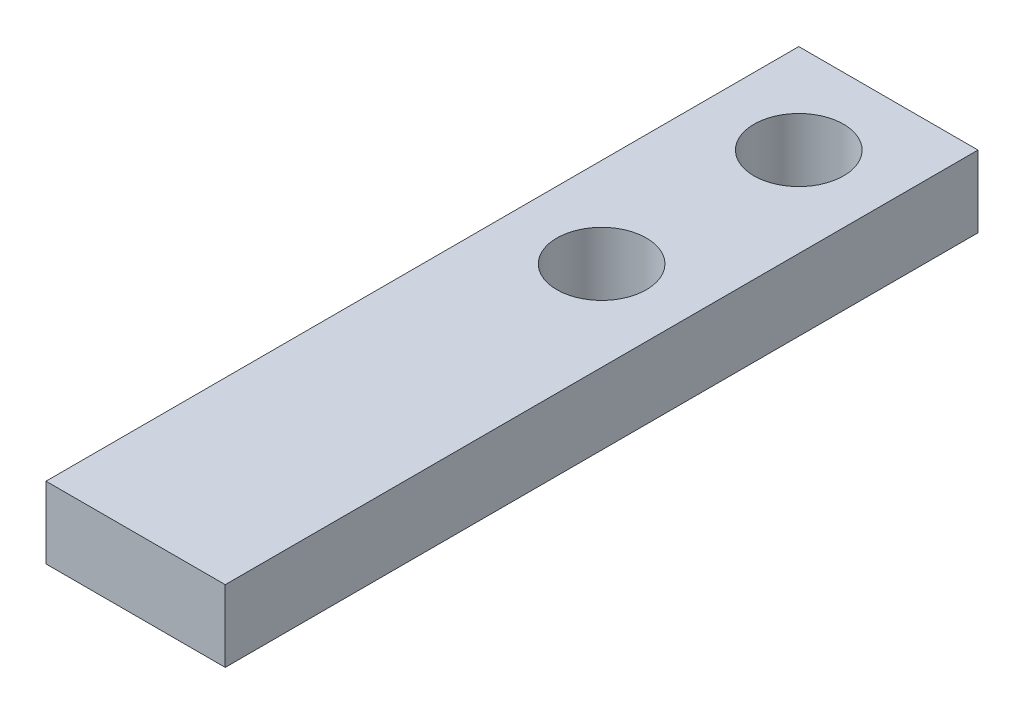
ISO-10303-21;
HEADER;
FILE_DESCRIPTION(('STEP AP214'),'2;1');
FILE_NAME('part.step','',(''),(''),'','','');
FILE_SCHEMA(('AUTOMOTIVE_DESIGN { 1 0 10303 214 1 1 1 1 }'));
ENDSEC;
DATA;
#1=APPLICATION_CONTEXT('core data for automotive mechanical design processes');
#2=APPLICATION_PROTOCOL_DEFINITION('international standard','automotive_design',2000,#1);
#3=PRODUCT_CONTEXT('',#1,'mechanical');
#4=PRODUCT('Part','Part','',(#3));
#5=PRODUCT_RELATED_PRODUCT_CATEGORY('part','',(#4));
#6=PRODUCT_DEFINITION_FORMATION('','',#4);
#7=PRODUCT_DEFINITION_CONTEXT('part definition',#1,'design');
#8=PRODUCT_DEFINITION('design','',#6,#7);
#9=PRODUCT_DEFINITION_SHAPE('','',#8);
#10=(LENGTH_UNIT() NAMED_UNIT(*) SI_UNIT(.MILLI.,.METRE.));
#11=(NAMED_UNIT(*) PLANE_ANGLE_UNIT() SI_UNIT($,.RADIAN.));
#12=(NAMED_UNIT(*) SI_UNIT($,.STERADIAN.) SOLID_ANGLE_UNIT());
#13=UNCERTAINTY_MEASURE_WITH_UNIT(LENGTH_MEASURE(1.E-05),#10,'distance_accuracy_value','');
#14=(GEOMETRIC_REPRESENTATION_CONTEXT(3) GLOBAL_UNCERTAINTY_ASSIGNED_CONTEXT((#13)) GLOBAL_UNIT_ASSIGNED_CONTEXT((#10,
#11,#12)) REPRESENTATION_CONTEXT('',''));
#15=CARTESIAN_POINT('',(0.,0.,0.));
#16=DIRECTION('',(0.,0.,1.));
#17=DIRECTION('',(1.,0.,0.));
#18=AXIS2_PLACEMENT_3D('',#15,#16,#17);
#19=CARTESIAN_POINT('',(0.,4.,0.));
#20=DIRECTION('',(0.,1.,0.));
#21=DIRECTION('',(0.,0.,1.));
#22=AXIS2_PLACEMENT_3D('',#19,#20,#21);
#23=PLANE('',#22);
#24=CARTESIAN_POINT('',(0.,4.,-16.));
#25=DIRECTION('',(0.,1.,0.));
#26=DIRECTION('',(0.,0.,1.));
#27=AXIS2_PLACEMENT_3D('',#24,#25,#26);
#28=CIRCLE('',#27,2.5);
#29=CARTESIAN_POINT('',(0.,4.,-13.5));
#30=VERTEX_POINT('',#29);
#31=EDGE_CURVE('E104',#30,#30,#28,.T.);
#32=ORIENTED_EDGE('',*,*,#31,.F.);
#33=EDGE_LOOP('',(#32));
#34=FACE_BOUND('',#33,.T.);
#35=DIRECTION('',(0.,0.,1.));
#36=VECTOR('',#35,1.);
#37=CARTESIAN_POINT('',(-5.,4.,-21.));
#38=LINE('',#37,#36);
#39=CARTESIAN_POINT('',(-5.,4.,-21.));
#40=VERTEX_POINT('',#39);
#41=CARTESIAN_POINT('',(-5.,4.,21.));
#42=VERTEX_POINT('',#41);
#43=EDGE_CURVE('E89',#40,#42,#38,.T.);
#44=ORIENTED_EDGE('',*,*,#43,.T.);
#45=DIRECTION('',(1.,0.,0.));
#46=VECTOR('',#45,1.);
#47=CARTESIAN_POINT('',(-5.,4.,21.));
#48=LINE('',#47,#46);
#49=CARTESIAN_POINT('',(5.,4.,21.));
#50=VERTEX_POINT('',#49);
#51=EDGE_CURVE('E84',#42,#50,#48,.T.);
#52=ORIENTED_EDGE('',*,*,#51,.T.);
#53=DIRECTION('',(0.,0.,-1.));
#54=VECTOR('',#53,1.);
#55=CARTESIAN_POINT('',(5.,4.,-21.));
#56=LINE('',#55,#54);
#57=CARTESIAN_POINT('',(5.,4.,-21.));
#58=VERTEX_POINT('',#57);
#59=EDGE_CURVE('E87',#50,#58,#56,.T.);
#60=ORIENTED_EDGE('',*,*,#59,.T.);
#61=DIRECTION('',(-1.,0.,0.));
#62=VECTOR('',#61,1.);
#63=CARTESIAN_POINT('',(-5.,4.,-21.));
#64=LINE('',#63,#62);
#65=EDGE_CURVE('E54',#58,#40,#64,.T.);
#66=ORIENTED_EDGE('',*,*,#65,.T.);
#67=EDGE_LOOP('',(#44,#52,#60,#66));
#68=FACE_BOUND('',#67,.T.);
#69=CARTESIAN_POINT('',(0.,4.,-5.));
#70=DIRECTION('',(0.,1.,0.));
#71=DIRECTION('',(0.,0.,1.));
#72=AXIS2_PLACEMENT_3D('',#69,#70,#71);
#73=CIRCLE('',#72,2.5);
#74=CARTESIAN_POINT('',(0.,4.,-2.5));
#75=VERTEX_POINT('',#74);
#76=EDGE_CURVE('E119',#75,#75,#73,.T.);
#77=ORIENTED_EDGE('',*,*,#76,.F.);
#78=EDGE_LOOP('',(#77));
#79=FACE_BOUND('',#78,.T.);
#80=ADVANCED_FACE('F37',(#34,#68,#79),#23,.T.);
#81=CARTESIAN_POINT('',(0.,0.,0.));
#82=DIRECTION('',(0.,1.,0.));
#83=DIRECTION('',(0.,0.,1.));
#84=AXIS2_PLACEMENT_3D('',#81,#82,#83);
#85=PLANE('',#84);
#86=DIRECTION('',(0.,0.,1.));
#87=VECTOR('',#86,1.);
#88=CARTESIAN_POINT('',(-5.,0.,-21.));
#89=LINE('',#88,#87);
#90=CARTESIAN_POINT('',(-5.,0.,-21.));
#91=VERTEX_POINT('',#90);
#92=CARTESIAN_POINT('',(-5.,0.,21.));
#93=VERTEX_POINT('',#92);
#94=EDGE_CURVE('E101',#91,#93,#89,.T.);
#95=ORIENTED_EDGE('',*,*,#94,.F.);
#96=DIRECTION('',(-1.,0.,0.));
#97=VECTOR('',#96,1.);
#98=CARTESIAN_POINT('',(-5.,0.,-21.));
#99=LINE('',#98,#97);
#100=CARTESIAN_POINT('',(5.,0.,-21.));
#101=VERTEX_POINT('',#100);
#102=EDGE_CURVE('E77',#101,#91,#99,.T.);
#103=ORIENTED_EDGE('',*,*,#102,.F.);
#104=DIRECTION('',(0.,0.,-1.));
#105=VECTOR('',#104,1.);
#106=CARTESIAN_POINT('',(5.,0.,-21.));
#107=LINE('',#106,#105);
#108=CARTESIAN_POINT('',(5.,0.,21.));
#109=VERTEX_POINT('',#108);
#110=EDGE_CURVE('E71',#109,#101,#107,.T.);
#111=ORIENTED_EDGE('',*,*,#110,.F.);
#112=DIRECTION('',(1.,0.,0.));
#113=VECTOR('',#112,1.);
#114=CARTESIAN_POINT('',(-5.,0.,21.));
#115=LINE('',#114,#113);
#116=EDGE_CURVE('E93',#93,#109,#115,.T.);
#117=ORIENTED_EDGE('',*,*,#116,.F.);
#118=EDGE_LOOP('',(#95,#103,#111,#117));
#119=FACE_BOUND('',#118,.T.);
#120=CARTESIAN_POINT('',(0.,0.,-16.));
#121=DIRECTION('',(0.,1.,0.));
#122=DIRECTION('',(0.,0.,1.));
#123=AXIS2_PLACEMENT_3D('',#120,#121,#122);
#124=CIRCLE('',#123,2.5);
#125=CARTESIAN_POINT('',(0.,0.,-13.5));
#126=VERTEX_POINT('',#125);
#127=EDGE_CURVE('E116',#126,#126,#124,.T.);
#128=ORIENTED_EDGE('',*,*,#127,.T.);
#129=EDGE_LOOP('',(#128));
#130=FACE_BOUND('',#129,.T.);
#131=CARTESIAN_POINT('',(0.,0.,-5.));
#132=DIRECTION('',(0.,1.,0.));
#133=DIRECTION('',(0.,0.,1.));
#134=AXIS2_PLACEMENT_3D('',#131,#132,#133);
#135=CIRCLE('',#134,2.5);
#136=CARTESIAN_POINT('',(0.,0.,-2.5));
#137=VERTEX_POINT('',#136);
#138=EDGE_CURVE('E122',#137,#137,#135,.T.);
#139=ORIENTED_EDGE('',*,*,#138,.T.);
#140=EDGE_LOOP('',(#139));
#141=FACE_BOUND('',#140,.T.);
#142=ADVANCED_FACE('F112',(#119,#130,#141),#85,.F.);
#143=CARTESIAN_POINT('',(-5.,4.,-21.));
#144=DIRECTION('',(1.,0.,0.));
#145=DIRECTION('',(0.,0.,-1.));
#146=AXIS2_PLACEMENT_3D('',#143,#144,#145);
#147=PLANE('',#146);
#148=ORIENTED_EDGE('',*,*,#94,.T.);
#149=DIRECTION('',(0.,-1.,0.));
#150=VECTOR('',#149,1.);
#151=CARTESIAN_POINT('',(-5.,4.,21.));
#152=LINE('',#151,#150);
#153=EDGE_CURVE('E11',#42,#93,#152,.T.);
#154=ORIENTED_EDGE('',*,*,#153,.F.);
#155=ORIENTED_EDGE('',*,*,#43,.F.);
#156=DIRECTION('',(0.,-1.,0.));
#157=VECTOR('',#156,1.);
#158=CARTESIAN_POINT('',(-5.,4.,-21.));
#159=LINE('',#158,#157);
#160=EDGE_CURVE('E97',#40,#91,#159,.T.);
#161=ORIENTED_EDGE('',*,*,#160,.T.);
#162=EDGE_LOOP('',(#148,#154,#155,#161));
#163=FACE_BOUND('',#162,.T.);
#164=ADVANCED_FACE('F39',(#163),#147,.F.);
#165=CARTESIAN_POINT('',(-5.,4.,21.));
#166=DIRECTION('',(0.,0.,-1.));
#167=DIRECTION('',(-1.,0.,0.));
#168=AXIS2_PLACEMENT_3D('',#165,#166,#167);
#169=PLANE('',#168);
#170=ORIENTED_EDGE('',*,*,#116,.T.);
#171=DIRECTION('',(0.,-1.,0.));
#172=VECTOR('',#171,1.);
#173=CARTESIAN_POINT('',(5.,4.,21.));
#174=LINE('',#173,#172);
#175=EDGE_CURVE('E46',#50,#109,#174,.T.);
#176=ORIENTED_EDGE('',*,*,#175,.F.);
#177=ORIENTED_EDGE('',*,*,#51,.F.);
#178=ORIENTED_EDGE('',*,*,#153,.T.);
#179=EDGE_LOOP('',(#170,#176,#177,#178));
#180=FACE_BOUND('',#179,.T.);
#181=ADVANCED_FACE('F92',(#180),#169,.F.);
#182=CARTESIAN_POINT('',(5.,4.,-21.));
#183=DIRECTION('',(-1.,0.,0.));
#184=DIRECTION('',(0.,0.,1.));
#185=AXIS2_PLACEMENT_3D('',#182,#183,#184);
#186=PLANE('',#185);
#187=ORIENTED_EDGE('',*,*,#110,.T.);
#188=DIRECTION('',(0.,-1.,0.));
#189=VECTOR('',#188,1.);
#190=CARTESIAN_POINT('',(5.,4.,-21.));
#191=LINE('',#190,#189);
#192=EDGE_CURVE('E94',#58,#101,#191,.T.);
#193=ORIENTED_EDGE('',*,*,#192,.F.);
#194=ORIENTED_EDGE('',*,*,#59,.F.);
#195=ORIENTED_EDGE('',*,*,#175,.T.);
#196=EDGE_LOOP('',(#187,#193,#194,#195));
#197=FACE_BOUND('',#196,.T.);
#198=ADVANCED_FACE('F95',(#197),#186,.F.);
#199=CARTESIAN_POINT('',(-5.,4.,-21.));
#200=DIRECTION('',(0.,0.,1.));
#201=DIRECTION('',(1.,0.,0.));
#202=AXIS2_PLACEMENT_3D('',#199,#200,#201);
#203=PLANE('',#202);
#204=ORIENTED_EDGE('',*,*,#102,.T.);
#205=ORIENTED_EDGE('',*,*,#160,.F.);
#206=ORIENTED_EDGE('',*,*,#65,.F.);
#207=ORIENTED_EDGE('',*,*,#192,.T.);
#208=EDGE_LOOP('',(#204,#205,#206,#207));
#209=FACE_BOUND('',#208,.T.);
#210=ADVANCED_FACE('F109',(#209),#203,.F.);
#211=CARTESIAN_POINT('',(0.,4.,-16.));
#212=DIRECTION('',(0.,-1.,0.));
#213=DIRECTION('',(0.,0.,-1.));
#214=AXIS2_PLACEMENT_3D('',#211,#212,#213);
#215=CYLINDRICAL_SURFACE('',#214,2.5);
#216=ORIENTED_EDGE('',*,*,#31,.T.);
#217=EDGE_LOOP('',(#216));
#218=FACE_BOUND('',#217,.T.);
#219=ORIENTED_EDGE('',*,*,#127,.F.);
#220=EDGE_LOOP('',(#219));
#221=FACE_BOUND('',#220,.T.);
#222=ADVANCED_FACE('F139',(#218,#221),#215,.F.);
#223=CARTESIAN_POINT('',(0.,4.,-5.));
#224=DIRECTION('',(0.,-1.,0.));
#225=DIRECTION('',(0.,0.,-1.));
#226=AXIS2_PLACEMENT_3D('',#223,#224,#225);
#227=CYLINDRICAL_SURFACE('',#226,2.5);
#228=ORIENTED_EDGE('',*,*,#76,.T.);
#229=EDGE_LOOP('',(#228));
#230=FACE_BOUND('',#229,.T.);
#231=ORIENTED_EDGE('',*,*,#138,.F.);
#232=EDGE_LOOP('',(#231));
#233=FACE_BOUND('',#232,.T.);
#234=ADVANCED_FACE('F128',(#230,#233),#227,.F.);
#235=CLOSED_SHELL('',(#80,#142,#164,#181,#198,#210,#222,#234));
#236=MANIFOLD_SOLID_BREP('B2',#235);
#237=ADVANCED_BREP_SHAPE_REPRESENTATION('',(#18,#236),#14);
#238=SHAPE_DEFINITION_REPRESENTATION(#9,#237);
ENDSEC;
END-ISO-10303-21;
